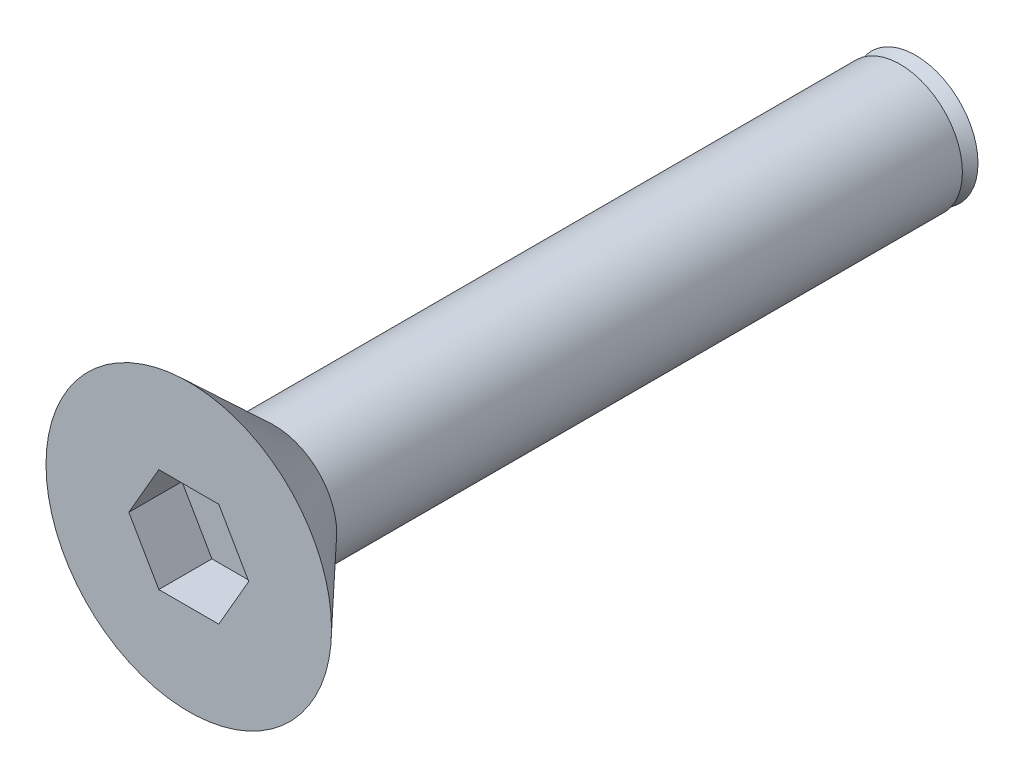
ISO-10303-21;
HEADER;
FILE_DESCRIPTION(('STEP AP214'),'2;1');
FILE_NAME('part.step','',(''),(''),'','','');
FILE_SCHEMA(('AUTOMOTIVE_DESIGN { 1 0 10303 214 1 1 1 1 }'));
ENDSEC;
DATA;
#1=APPLICATION_CONTEXT('core data for automotive mechanical design processes');
#2=APPLICATION_PROTOCOL_DEFINITION('international standard','automotive_design',2000,#1);
#3=PRODUCT_CONTEXT('',#1,'mechanical');
#4=PRODUCT('Part','Part','',(#3));
#5=PRODUCT_RELATED_PRODUCT_CATEGORY('part','',(#4));
#6=PRODUCT_DEFINITION_FORMATION('','',#4);
#7=PRODUCT_DEFINITION_CONTEXT('part definition',#1,'design');
#8=PRODUCT_DEFINITION('design','',#6,#7);
#9=PRODUCT_DEFINITION_SHAPE('','',#8);
#10=(LENGTH_UNIT() NAMED_UNIT(*) SI_UNIT(.MILLI.,.METRE.));
#11=(NAMED_UNIT(*) PLANE_ANGLE_UNIT() SI_UNIT($,.RADIAN.));
#12=(NAMED_UNIT(*) SI_UNIT($,.STERADIAN.) SOLID_ANGLE_UNIT());
#13=UNCERTAINTY_MEASURE_WITH_UNIT(LENGTH_MEASURE(1.E-05),#10,'distance_accuracy_value','');
#14=(GEOMETRIC_REPRESENTATION_CONTEXT(3) GLOBAL_UNCERTAINTY_ASSIGNED_CONTEXT((#13)) GLOBAL_UNIT_ASSIGNED_CONTEXT((#10,
#11,#12)) REPRESENTATION_CONTEXT('',''));
#15=CARTESIAN_POINT('',(0.,0.,0.));
#16=DIRECTION('',(0.,0.,1.));
#17=DIRECTION('',(1.,0.,0.));
#18=AXIS2_PLACEMENT_3D('',#15,#16,#17);
#19=CARTESIAN_POINT('',(0.,0.,-14.));
#20=DIRECTION('',(0.,0.,1.));
#21=DIRECTION('',(1.,0.,0.));
#22=AXIS2_PLACEMENT_3D('',#19,#20,#21);
#23=PLANE('',#22);
#24=CARTESIAN_POINT('',(0.,0.,-14.));
#25=DIRECTION('',(0.,0.,1.));
#26=DIRECTION('',(1.,0.,0.));
#27=AXIS2_PLACEMENT_3D('',#24,#25,#26);
#28=CIRCLE('',#27,1.2);
#29=CARTESIAN_POINT('',(1.2,0.,-14.));
#30=VERTEX_POINT('',#29);
#31=EDGE_CURVE('E9',#30,#30,#28,.T.);
#32=ORIENTED_EDGE('',*,*,#31,.F.);
#33=EDGE_LOOP('',(#32));
#34=FACE_BOUND('',#33,.T.);
#35=ADVANCED_FACE('F14',(#34),#23,.F.);
#36=CARTESIAN_POINT('',(0.,0.,-14.));
#37=DIRECTION('',(0.,0.,-1.));
#38=DIRECTION('',(1.,0.,0.));
#39=AXIS2_PLACEMENT_3D('',#36,#37,#38);
#40=CONICAL_SURFACE('',#39,1.2,0.785398163397);
#41=CARTESIAN_POINT('',(0.,0.,-13.7));
#42=DIRECTION('',(0.,0.,1.));
#43=DIRECTION('',(1.,0.,0.));
#44=AXIS2_PLACEMENT_3D('',#41,#42,#43);
#45=CIRCLE('',#44,0.9);
#46=CARTESIAN_POINT('',(0.9,0.,-13.7));
#47=VERTEX_POINT('',#46);
#48=EDGE_CURVE('E144',#47,#47,#45,.T.);
#49=ORIENTED_EDGE('',*,*,#48,.F.);
#50=DIRECTION('',(-0.707106781186548,0.,0.707106781186548));
#51=VECTOR('',#50,1.);
#52=CARTESIAN_POINT('',(1.2,0.,-14.));
#53=LINE('',#52,#51);
#54=EDGE_CURVE('E25',#30,#47,#53,.T.);
#55=ORIENTED_EDGE('',*,*,#54,.F.);
#56=ORIENTED_EDGE('',*,*,#31,.T.);
#57=ORIENTED_EDGE('',*,*,#54,.T.);
#58=EDGE_LOOP('',(#49,#55,#56,#57));
#59=FACE_BOUND('',#58,.T.);
#60=ADVANCED_FACE('F310',(#59),#40,.T.);
#61=CARTESIAN_POINT('',(0.,0.,-1.023));
#62=DIRECTION('',(0.,0.,1.));
#63=DIRECTION('',(1.,0.,0.));
#64=AXIS2_PLACEMENT_3D('',#61,#62,#63);
#65=PLANE('',#64);
#66=DIRECTION('',(-0.50000000000019,0.866025403784329,0.));
#67=VECTOR('',#66,1.);
#68=CARTESIAN_POINT('',(1.154700538379,0.,-1.023));
#69=LINE('',#68,#67);
#70=CARTESIAN_POINT('',(1.154700538379,0.,-1.023));
#71=VERTEX_POINT('',#70);
#72=CARTESIAN_POINT('',(0.57735026919,1.,-1.023));
#73=VERTEX_POINT('',#72);
#74=EDGE_CURVE('E133',#71,#73,#69,.T.);
#75=ORIENTED_EDGE('',*,*,#74,.T.);
#76=DIRECTION('',(-1.,0.,0.));
#77=VECTOR('',#76,1.);
#78=CARTESIAN_POINT('',(0.57735026919,1.,-1.023));
#79=LINE('',#78,#77);
#80=CARTESIAN_POINT('',(-0.57735026919,1.,-1.023));
#81=VERTEX_POINT('',#80);
#82=EDGE_CURVE('E216',#73,#81,#79,.T.);
#83=ORIENTED_EDGE('',*,*,#82,.T.);
#84=DIRECTION('',(-0.50000000000019,-0.866025403784329,0.));
#85=VECTOR('',#84,1.);
#86=CARTESIAN_POINT('',(-0.57735026919,1.,-1.023));
#87=LINE('',#86,#85);
#88=CARTESIAN_POINT('',(-1.154700538379,0.,-1.023));
#89=VERTEX_POINT('',#88);
#90=EDGE_CURVE('E167',#81,#89,#87,.T.);
#91=ORIENTED_EDGE('',*,*,#90,.T.);
#92=DIRECTION('',(0.50000000000019,-0.866025403784329,0.));
#93=VECTOR('',#92,1.);
#94=CARTESIAN_POINT('',(-1.154700538379,0.,-1.023));
#95=LINE('',#94,#93);
#96=CARTESIAN_POINT('',(-0.57735026919,-1.,-1.023));
#97=VERTEX_POINT('',#96);
#98=EDGE_CURVE('E18',#89,#97,#95,.T.);
#99=ORIENTED_EDGE('',*,*,#98,.T.);
#100=DIRECTION('',(1.,0.,0.));
#101=VECTOR('',#100,1.);
#102=CARTESIAN_POINT('',(-0.57735026919,-1.,-1.023));
#103=LINE('',#102,#101);
#104=CARTESIAN_POINT('',(0.57735026919,-1.,-1.023));
#105=VERTEX_POINT('',#104);
#106=EDGE_CURVE('E154',#97,#105,#103,.T.);
#107=ORIENTED_EDGE('',*,*,#106,.T.);
#108=DIRECTION('',(0.50000000000019,0.866025403784329,0.));
#109=VECTOR('',#108,1.);
#110=CARTESIAN_POINT('',(0.57735026919,-1.,-1.023));
#111=LINE('',#110,#109);
#112=EDGE_CURVE('E146',#105,#71,#111,.T.);
#113=ORIENTED_EDGE('',*,*,#112,.T.);
#114=EDGE_LOOP('',(#75,#83,#91,#99,#107,#113));
#115=FACE_BOUND('',#114,.T.);
#116=ADVANCED_FACE('F16',(#115),#65,.T.);
#117=CARTESIAN_POINT('',(0.,0.,-13.7));
#118=DIRECTION('',(0.,0.,1.));
#119=DIRECTION('',(1.,0.,0.));
#120=AXIS2_PLACEMENT_3D('',#117,#118,#119);
#121=PLANE('',#120);
#122=ORIENTED_EDGE('',*,*,#48,.T.);
#123=EDGE_LOOP('',(#122));
#124=FACE_BOUND('',#123,.T.);
#125=CARTESIAN_POINT('',(0.,0.,-13.7));
#126=DIRECTION('',(0.,0.,1.));
#127=DIRECTION('',(1.,0.,0.));
#128=AXIS2_PLACEMENT_3D('',#125,#126,#127);
#129=CIRCLE('',#128,1.2);
#130=CARTESIAN_POINT('',(1.2,0.,-13.7));
#131=VERTEX_POINT('',#130);
#132=EDGE_CURVE('E192',#131,#131,#129,.T.);
#133=ORIENTED_EDGE('',*,*,#132,.F.);
#134=EDGE_LOOP('',(#133));
#135=FACE_BOUND('',#134,.T.);
#136=ADVANCED_FACE('F297',(#124,#135),#121,.F.);
#137=CARTESIAN_POINT('',(1.154700538379,0.,-1.023));
#138=DIRECTION('',(-0.866025403784329,-0.50000000000019,0.));
#139=DIRECTION('',(-0.50000000000019,0.866025403784329,0.));
#140=AXIS2_PLACEMENT_3D('',#137,#138,#139);
#141=PLANE('',#140);
#142=ORIENTED_EDGE('',*,*,#74,.F.);
#143=DIRECTION('',(0.,0.,1.));
#144=VECTOR('',#143,1.);
#145=CARTESIAN_POINT('',(1.154700538379,0.,-1.023));
#146=LINE('',#145,#144);
#147=CARTESIAN_POINT('',(1.154700538379,0.,0.));
#148=VERTEX_POINT('',#147);
#149=EDGE_CURVE('E137',#71,#148,#146,.T.);
#150=ORIENTED_EDGE('',*,*,#149,.T.);
#151=DIRECTION('',(0.50000000000019,-0.866025403784329,0.));
#152=VECTOR('',#151,1.);
#153=CARTESIAN_POINT('',(1.010362971082,0.25,0.));
#154=LINE('',#153,#152);
#155=CARTESIAN_POINT('',(0.57735026919,1.,0.));
#156=VERTEX_POINT('',#155);
#157=EDGE_CURVE('E178',#156,#148,#154,.T.);
#158=ORIENTED_EDGE('',*,*,#157,.F.);
#159=DIRECTION('',(0.,0.,1.));
#160=VECTOR('',#159,1.);
#161=CARTESIAN_POINT('',(0.57735026919,1.,-1.023));
#162=LINE('',#161,#160);
#163=EDGE_CURVE('E138',#73,#156,#162,.T.);
#164=ORIENTED_EDGE('',*,*,#163,.F.);
#165=EDGE_LOOP('',(#142,#150,#158,#164));
#166=FACE_BOUND('',#165,.T.);
#167=ADVANCED_FACE('F135',(#166),#141,.T.);
#168=CARTESIAN_POINT('',(0.57735026919,-1.,-1.023));
#169=DIRECTION('',(-0.866025403784329,0.50000000000019,0.));
#170=DIRECTION('',(0.,0.,1.));
#171=AXIS2_PLACEMENT_3D('',#168,#169,#170);
#172=PLANE('',#171);
#173=ORIENTED_EDGE('',*,*,#112,.F.);
#174=DIRECTION('',(0.,0.,1.));
#175=VECTOR('',#174,1.);
#176=CARTESIAN_POINT('',(0.57735026919,-1.,-1.023));
#177=LINE('',#176,#175);
#178=CARTESIAN_POINT('',(0.57735026919,-1.,0.));
#179=VERTEX_POINT('',#178);
#180=EDGE_CURVE('E76',#105,#179,#177,.T.);
#181=ORIENTED_EDGE('',*,*,#180,.T.);
#182=DIRECTION('',(-0.50000000000019,-0.866025403784329,0.));
#183=VECTOR('',#182,1.);
#184=CARTESIAN_POINT('',(0.721687836487,-0.75,0.));
#185=LINE('',#184,#183);
#186=EDGE_CURVE('E148',#148,#179,#185,.T.);
#187=ORIENTED_EDGE('',*,*,#186,.F.);
#188=ORIENTED_EDGE('',*,*,#149,.F.);
#189=EDGE_LOOP('',(#173,#181,#187,#188));
#190=FACE_BOUND('',#189,.T.);
#191=ADVANCED_FACE('F145',(#190),#172,.T.);
#192=CARTESIAN_POINT('',(-0.57735026919,-1.,-1.023));
#193=DIRECTION('',(0.,1.,0.));
#194=DIRECTION('',(1.,0.,0.));
#195=AXIS2_PLACEMENT_3D('',#192,#193,#194);
#196=PLANE('',#195);
#197=ORIENTED_EDGE('',*,*,#106,.F.);
#198=DIRECTION('',(0.,0.,1.));
#199=VECTOR('',#198,1.);
#200=CARTESIAN_POINT('',(-0.57735026919,-1.,-1.023));
#201=LINE('',#200,#199);
#202=CARTESIAN_POINT('',(-0.57735026919,-1.,0.));
#203=VERTEX_POINT('',#202);
#204=EDGE_CURVE('E84',#97,#203,#201,.T.);
#205=ORIENTED_EDGE('',*,*,#204,.T.);
#206=DIRECTION('',(-1.,0.,0.));
#207=VECTOR('',#206,1.);
#208=CARTESIAN_POINT('',(-0.288675134595,-1.,0.));
#209=LINE('',#208,#207);
#210=EDGE_CURVE('E180',#179,#203,#209,.T.);
#211=ORIENTED_EDGE('',*,*,#210,.F.);
#212=ORIENTED_EDGE('',*,*,#180,.F.);
#213=EDGE_LOOP('',(#197,#205,#211,#212));
#214=FACE_BOUND('',#213,.T.);
#215=ADVANCED_FACE('F288',(#214),#196,.T.);
#216=CARTESIAN_POINT('',(-1.154700538379,0.,-1.023));
#217=DIRECTION('',(0.866025403784329,0.50000000000019,0.));
#218=DIRECTION('',(0.,0.,-1.));
#219=AXIS2_PLACEMENT_3D('',#216,#217,#218);
#220=PLANE('',#219);
#221=ORIENTED_EDGE('',*,*,#98,.F.);
#222=DIRECTION('',(0.,0.,1.));
#223=VECTOR('',#222,1.);
#224=CARTESIAN_POINT('',(-1.154700538379,0.,-1.023));
#225=LINE('',#224,#223);
#226=CARTESIAN_POINT('',(-1.154700538379,0.,0.));
#227=VERTEX_POINT('',#226);
#228=EDGE_CURVE('E94',#89,#227,#225,.T.);
#229=ORIENTED_EDGE('',*,*,#228,.T.);
#230=DIRECTION('',(-0.50000000000019,0.866025403784329,0.));
#231=VECTOR('',#230,1.);
#232=CARTESIAN_POINT('',(-1.010362971082,-0.25,0.));
#233=LINE('',#232,#231);
#234=EDGE_CURVE('E184',#203,#227,#233,.T.);
#235=ORIENTED_EDGE('',*,*,#234,.F.);
#236=ORIENTED_EDGE('',*,*,#204,.F.);
#237=EDGE_LOOP('',(#221,#229,#235,#236));
#238=FACE_BOUND('',#237,.T.);
#239=ADVANCED_FACE('F281',(#238),#220,.T.);
#240=CARTESIAN_POINT('',(-0.57735026919,1.,-1.023));
#241=DIRECTION('',(0.866025403784329,-0.50000000000019,0.));
#242=DIRECTION('',(0.,0.,-1.));
#243=AXIS2_PLACEMENT_3D('',#240,#241,#242);
#244=PLANE('',#243);
#245=ORIENTED_EDGE('',*,*,#90,.F.);
#246=DIRECTION('',(0.,0.,1.));
#247=VECTOR('',#246,1.);
#248=CARTESIAN_POINT('',(-0.57735026919,1.,-1.023));
#249=LINE('',#248,#247);
#250=CARTESIAN_POINT('',(-0.57735026919,1.,0.));
#251=VERTEX_POINT('',#250);
#252=EDGE_CURVE('E126',#81,#251,#249,.T.);
#253=ORIENTED_EDGE('',*,*,#252,.T.);
#254=DIRECTION('',(0.50000000000019,0.866025403784329,0.));
#255=VECTOR('',#254,1.);
#256=CARTESIAN_POINT('',(-0.721687836487,0.75,0.));
#257=LINE('',#256,#255);
#258=EDGE_CURVE('E164',#227,#251,#257,.T.);
#259=ORIENTED_EDGE('',*,*,#258,.F.);
#260=ORIENTED_EDGE('',*,*,#228,.F.);
#261=EDGE_LOOP('',(#245,#253,#259,#260));
#262=FACE_BOUND('',#261,.T.);
#263=ADVANCED_FACE('F287',(#262),#244,.T.);
#264=CARTESIAN_POINT('',(0.57735026919,1.,-1.023));
#265=DIRECTION('',(0.,-1.,0.));
#266=DIRECTION('',(-1.,0.,0.));
#267=AXIS2_PLACEMENT_3D('',#264,#265,#266);
#268=PLANE('',#267);
#269=ORIENTED_EDGE('',*,*,#82,.F.);
#270=ORIENTED_EDGE('',*,*,#163,.T.);
#271=DIRECTION('',(1.,0.,0.));
#272=VECTOR('',#271,1.);
#273=CARTESIAN_POINT('',(0.288675134595,1.,0.));
#274=LINE('',#273,#272);
#275=EDGE_CURVE('E174',#251,#156,#274,.T.);
#276=ORIENTED_EDGE('',*,*,#275,.F.);
#277=ORIENTED_EDGE('',*,*,#252,.F.);
#278=EDGE_LOOP('',(#269,#270,#276,#277));
#279=FACE_BOUND('',#278,.T.);
#280=ADVANCED_FACE('F347',(#279),#268,.T.);
#281=CARTESIAN_POINT('',(0.,0.,-13.7));
#282=DIRECTION('',(0.,0.,1.));
#283=DIRECTION('',(1.,0.,0.));
#284=AXIS2_PLACEMENT_3D('',#281,#282,#283);
#285=CYLINDRICAL_SURFACE('',#284,1.2);
#286=CARTESIAN_POINT('',(0.,0.,-1.65));
#287=DIRECTION('',(0.,0.,1.));
#288=DIRECTION('',(1.,0.,0.));
#289=AXIS2_PLACEMENT_3D('',#286,#287,#288);
#290=CIRCLE('',#289,1.2);
#291=CARTESIAN_POINT('',(1.2,0.,-1.65));
#292=VERTEX_POINT('',#291);
#293=EDGE_CURVE('E179',#292,#292,#290,.T.);
#294=ORIENTED_EDGE('',*,*,#293,.F.);
#295=DIRECTION('',(0.,0.,1.));
#296=VECTOR('',#295,1.);
#297=CARTESIAN_POINT('',(1.2,0.,-13.7));
#298=LINE('',#297,#296);
#299=EDGE_CURVE('E117',#131,#292,#298,.T.);
#300=ORIENTED_EDGE('',*,*,#299,.F.);
#301=ORIENTED_EDGE('',*,*,#132,.T.);
#302=ORIENTED_EDGE('',*,*,#299,.T.);
#303=EDGE_LOOP('',(#294,#300,#301,#302));
#304=FACE_BOUND('',#303,.T.);
#305=ADVANCED_FACE('F336',(#304),#285,.T.);
#306=CARTESIAN_POINT('',(0.,0.,0.));
#307=DIRECTION('',(0.,0.,1.));
#308=DIRECTION('',(1.,0.,0.));
#309=AXIS2_PLACEMENT_3D('',#306,#307,#308);
#310=PLANE('',#309);
#311=ORIENTED_EDGE('',*,*,#275,.T.);
#312=ORIENTED_EDGE('',*,*,#157,.T.);
#313=ORIENTED_EDGE('',*,*,#186,.T.);
#314=ORIENTED_EDGE('',*,*,#210,.T.);
#315=ORIENTED_EDGE('',*,*,#234,.T.);
#316=ORIENTED_EDGE('',*,*,#258,.T.);
#317=EDGE_LOOP('',(#311,#312,#313,#314,#315,#316));
#318=FACE_BOUND('',#317,.T.);
#319=CARTESIAN_POINT('',(0.,0.,0.));
#320=DIRECTION('',(0.,0.,1.));
#321=DIRECTION('',(1.,0.,0.));
#322=AXIS2_PLACEMENT_3D('',#319,#320,#321);
#323=CIRCLE('',#322,2.75);
#324=CARTESIAN_POINT('',(2.75,0.,0.));
#325=VERTEX_POINT('',#324);
#326=EDGE_CURVE('E169',#325,#325,#323,.T.);
#327=ORIENTED_EDGE('',*,*,#326,.T.);
#328=EDGE_LOOP('',(#327));
#329=FACE_BOUND('',#328,.T.);
#330=ADVANCED_FACE('F330',(#318,#329),#310,.T.);
#331=CARTESIAN_POINT('',(0.,0.,-1.65));
#332=DIRECTION('',(0.,0.,1.));
#333=DIRECTION('',(1.,0.,0.));
#334=AXIS2_PLACEMENT_3D('',#331,#332,#333);
#335=CONICAL_SURFACE('',#334,1.2,0.754158329967);
#336=ORIENTED_EDGE('',*,*,#326,.F.);
#337=DIRECTION('',(0.684675461664016,0.,0.728848072094018));
#338=VECTOR('',#337,1.);
#339=CARTESIAN_POINT('',(1.2,0.,-1.65));
#340=LINE('',#339,#338);
#341=EDGE_CURVE('E109',#292,#325,#340,.T.);
#342=ORIENTED_EDGE('',*,*,#341,.F.);
#343=ORIENTED_EDGE('',*,*,#293,.T.);
#344=ORIENTED_EDGE('',*,*,#341,.T.);
#345=EDGE_LOOP('',(#336,#342,#343,#344));
#346=FACE_BOUND('',#345,.T.);
#347=ADVANCED_FACE('F335',(#346),#335,.T.);
#348=CLOSED_SHELL('',(#35,#60,#116,#136,#167,#191,#215,#239,#263,#280,#305,#330,#347));
#349=MANIFOLD_SOLID_BREP('B1',#348);
#350=ADVANCED_BREP_SHAPE_REPRESENTATION('',(#18,#349),#14);
#351=SHAPE_DEFINITION_REPRESENTATION(#9,#350);
ENDSEC;
END-ISO-10303-21;
